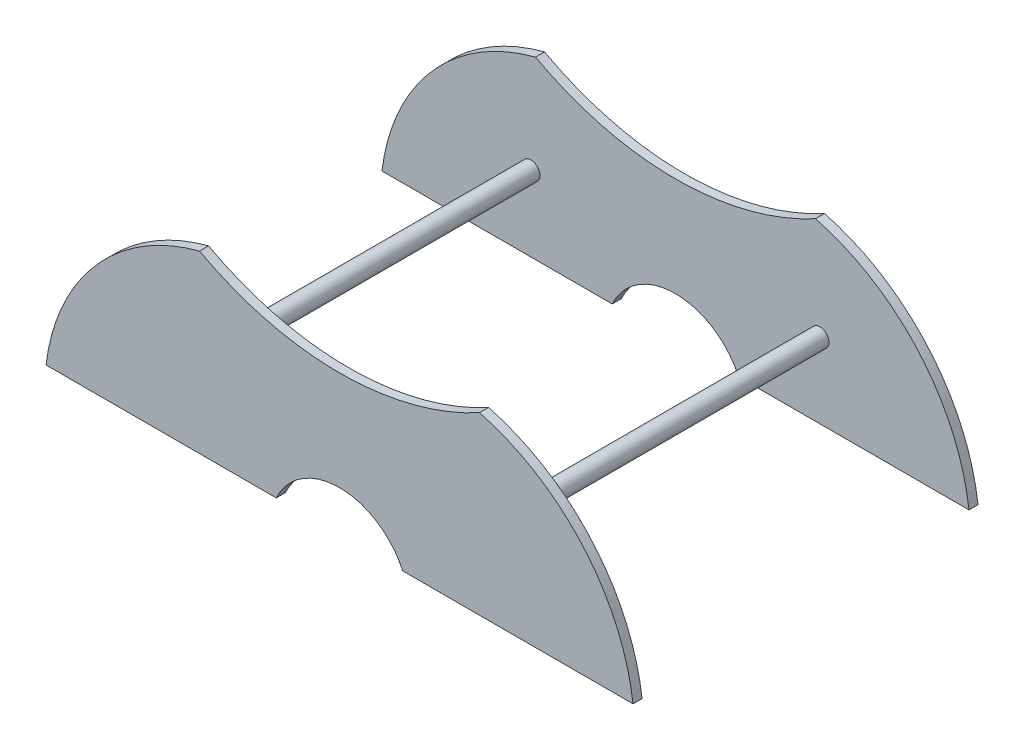
ISO-10303-21;
HEADER;
FILE_DESCRIPTION(('STEP AP214'),'2;1');
FILE_NAME('part.step','',(''),(''),'','','');
FILE_SCHEMA(('AUTOMOTIVE_DESIGN { 1 0 10303 214 1 1 1 1 }'));
ENDSEC;
DATA;
#1=APPLICATION_CONTEXT('core data for automotive mechanical design processes');
#2=APPLICATION_PROTOCOL_DEFINITION('international standard','automotive_design',2000,#1);
#3=PRODUCT_CONTEXT('',#1,'mechanical');
#4=PRODUCT('Part','Part','',(#3));
#5=PRODUCT_RELATED_PRODUCT_CATEGORY('part','',(#4));
#6=PRODUCT_DEFINITION_FORMATION('','',#4);
#7=PRODUCT_DEFINITION_CONTEXT('part definition',#1,'design');
#8=PRODUCT_DEFINITION('design','',#6,#7);
#9=PRODUCT_DEFINITION_SHAPE('','',#8);
#10=(LENGTH_UNIT() NAMED_UNIT(*) SI_UNIT(.MILLI.,.METRE.));
#11=(NAMED_UNIT(*) PLANE_ANGLE_UNIT() SI_UNIT($,.RADIAN.));
#12=(NAMED_UNIT(*) SI_UNIT($,.STERADIAN.) SOLID_ANGLE_UNIT());
#13=UNCERTAINTY_MEASURE_WITH_UNIT(LENGTH_MEASURE(1.E-05),#10,'distance_accuracy_value','');
#14=(GEOMETRIC_REPRESENTATION_CONTEXT(3) GLOBAL_UNCERTAINTY_ASSIGNED_CONTEXT((#13)) GLOBAL_UNIT_ASSIGNED_CONTEXT((#10,
#11,#12)) REPRESENTATION_CONTEXT('',''));
#15=CARTESIAN_POINT('',(0.,0.,0.));
#16=DIRECTION('',(0.,0.,1.));
#17=DIRECTION('',(1.,0.,0.));
#18=AXIS2_PLACEMENT_3D('',#15,#16,#17);
#19=CARTESIAN_POINT('',(0.,-32.0780298646909,10.));
#20=DIRECTION('',(0.,0.,-1.));
#21=DIRECTION('',(-1.,0.,0.));
#22=AXIS2_PLACEMENT_3D('',#19,#20,#21);
#23=CYLINDRICAL_SURFACE('',#22,77.);
#24=CARTESIAN_POINT('',(0.,-32.0780298646909,0.));
#25=DIRECTION('',(0.,0.,-1.));
#26=DIRECTION('',(-1.,0.,0.));
#27=AXIS2_PLACEMENT_3D('',#24,#25,#26);
#28=CIRCLE('',#27,77.);
#29=CARTESIAN_POINT('',(-70.,0.,0.));
#30=VERTEX_POINT('',#29);
#31=CARTESIAN_POINT('',(70.,0.,0.));
#32=VERTEX_POINT('',#31);
#33=EDGE_CURVE('E123',#30,#32,#28,.T.);
#34=ORIENTED_EDGE('',*,*,#33,.T.);
#35=DIRECTION('',(0.,0.,-1.));
#36=VECTOR('',#35,1.);
#37=CARTESIAN_POINT('',(70.,0.,10.));
#38=LINE('',#37,#36);
#39=CARTESIAN_POINT('',(70.,0.,10.));
#40=VERTEX_POINT('',#39);
#41=EDGE_CURVE('E141',#40,#32,#38,.T.);
#42=ORIENTED_EDGE('',*,*,#41,.F.);
#43=CARTESIAN_POINT('',(0.,-32.0780298646909,10.));
#44=DIRECTION('',(0.,0.,-1.));
#45=DIRECTION('',(-1.,0.,0.));
#46=AXIS2_PLACEMENT_3D('',#43,#44,#45);
#47=CIRCLE('',#46,77.);
#48=CARTESIAN_POINT('',(-70.,0.,10.));
#49=VERTEX_POINT('',#48);
#50=EDGE_CURVE('E134',#49,#40,#47,.T.);
#51=ORIENTED_EDGE('',*,*,#50,.F.);
#52=DIRECTION('',(0.,0.,-1.));
#53=VECTOR('',#52,1.);
#54=CARTESIAN_POINT('',(-70.,0.,10.));
#55=LINE('',#54,#53);
#56=EDGE_CURVE('E119',#49,#30,#55,.T.);
#57=ORIENTED_EDGE('',*,*,#56,.T.);
#58=EDGE_LOOP('',(#34,#42,#51,#57));
#59=FACE_BOUND('',#58,.T.);
#60=ADVANCED_FACE('F32',(#59),#23,.F.);
#61=CARTESIAN_POINT('',(70.,0.,10.));
#62=DIRECTION('',(0.,1.,0.));
#63=DIRECTION('',(0.,0.,1.));
#64=AXIS2_PLACEMENT_3D('',#61,#62,#63);
#65=PLANE('',#64);
#66=DIRECTION('',(1.,0.,0.));
#67=VECTOR('',#66,1.);
#68=CARTESIAN_POINT('',(70.,0.,0.));
#69=LINE('',#68,#67);
#70=CARTESIAN_POINT('',(325.,0.,0.));
#71=VERTEX_POINT('',#70);
#72=EDGE_CURVE('E126',#32,#71,#69,.T.);
#73=ORIENTED_EDGE('',*,*,#72,.T.);
#74=DIRECTION('',(0.,0.,-1.));
#75=VECTOR('',#74,1.);
#76=CARTESIAN_POINT('',(325.,0.,10.));
#77=LINE('',#76,#75);
#78=CARTESIAN_POINT('',(325.,0.,10.));
#79=VERTEX_POINT('',#78);
#80=EDGE_CURVE('E138',#79,#71,#77,.T.);
#81=ORIENTED_EDGE('',*,*,#80,.F.);
#82=DIRECTION('',(1.,0.,0.));
#83=VECTOR('',#82,1.);
#84=CARTESIAN_POINT('',(70.,0.,10.));
#85=LINE('',#84,#83);
#86=EDGE_CURVE('E89',#40,#79,#85,.T.);
#87=ORIENTED_EDGE('',*,*,#86,.F.);
#88=ORIENTED_EDGE('',*,*,#41,.T.);
#89=EDGE_LOOP('',(#73,#81,#87,#88));
#90=FACE_BOUND('',#89,.T.);
#91=ADVANCED_FACE('F210',(#90),#65,.F.);
#92=CARTESIAN_POINT('',(96.7434752557816,-28.2658612409388,10.));
#93=DIRECTION('',(0.,0.,-1.));
#94=DIRECTION('',(-1.,0.,0.));
#95=AXIS2_PLACEMENT_3D('',#92,#93,#94);
#96=CYLINDRICAL_SURFACE('',#95,230.);
#97=CARTESIAN_POINT('',(96.7434752557816,-28.2658612409388,0.));
#98=DIRECTION('',(0.,0.,1.));
#99=DIRECTION('',(1.,0.,0.));
#100=AXIS2_PLACEMENT_3D('',#97,#98,#99);
#101=CIRCLE('',#100,230.);
#102=CARTESIAN_POINT('',(155.,194.233975443779,0.));
#103=VERTEX_POINT('',#102);
#104=EDGE_CURVE('E129',#71,#103,#101,.T.);
#105=ORIENTED_EDGE('',*,*,#104,.T.);
#106=DIRECTION('',(0.,0.,-1.));
#107=VECTOR('',#106,1.);
#108=CARTESIAN_POINT('',(155.,194.233975443779,10.));
#109=LINE('',#108,#107);
#110=CARTESIAN_POINT('',(155.,194.233975443779,10.));
#111=VERTEX_POINT('',#110);
#112=EDGE_CURVE('E114',#111,#103,#109,.T.);
#113=ORIENTED_EDGE('',*,*,#112,.F.);
#114=CARTESIAN_POINT('',(96.7434752557816,-28.2658612409388,10.));
#115=DIRECTION('',(0.,0.,1.));
#116=DIRECTION('',(1.,0.,0.));
#117=AXIS2_PLACEMENT_3D('',#114,#115,#116);
#118=CIRCLE('',#117,230.);
#119=EDGE_CURVE('E105',#79,#111,#118,.T.);
#120=ORIENTED_EDGE('',*,*,#119,.F.);
#121=ORIENTED_EDGE('',*,*,#80,.T.);
#122=EDGE_LOOP('',(#105,#113,#120,#121));
#123=FACE_BOUND('',#122,.T.);
#124=ADVANCED_FACE('F213',(#123),#96,.T.);
#125=CARTESIAN_POINT('',(0.,480.146205845612,10.));
#126=DIRECTION('',(0.,0.,-1.));
#127=DIRECTION('',(-1.,0.,0.));
#128=AXIS2_PLACEMENT_3D('',#125,#126,#127);
#129=CYLINDRICAL_SURFACE('',#128,325.224235710303);
#130=CARTESIAN_POINT('',(0.,480.146205845612,0.));
#131=DIRECTION('',(0.,0.,-1.));
#132=DIRECTION('',(1.,0.,0.));
#133=AXIS2_PLACEMENT_3D('',#130,#131,#132);
#134=CIRCLE('',#133,325.224235710303);
#135=CARTESIAN_POINT('',(-155.,194.233975443779,0.));
#136=VERTEX_POINT('',#135);
#137=EDGE_CURVE('E113',#103,#136,#134,.T.);
#138=ORIENTED_EDGE('',*,*,#137,.T.);
#139=DIRECTION('',(0.,0.,-1.));
#140=VECTOR('',#139,1.);
#141=CARTESIAN_POINT('',(-155.,194.233975443779,10.));
#142=LINE('',#141,#140);
#143=CARTESIAN_POINT('',(-155.,194.233975443779,10.));
#144=VERTEX_POINT('',#143);
#145=EDGE_CURVE('E110',#144,#136,#142,.T.);
#146=ORIENTED_EDGE('',*,*,#145,.F.);
#147=CARTESIAN_POINT('',(0.,480.146205845612,10.));
#148=DIRECTION('',(0.,0.,-1.));
#149=DIRECTION('',(1.,0.,0.));
#150=AXIS2_PLACEMENT_3D('',#147,#148,#149);
#151=CIRCLE('',#150,325.224235710303);
#152=EDGE_CURVE('E99',#111,#144,#151,.T.);
#153=ORIENTED_EDGE('',*,*,#152,.F.);
#154=ORIENTED_EDGE('',*,*,#112,.T.);
#155=EDGE_LOOP('',(#138,#146,#153,#154));
#156=FACE_BOUND('',#155,.T.);
#157=ADVANCED_FACE('F111',(#156),#129,.F.);
#158=CARTESIAN_POINT('',(-96.7434752557816,-28.2658612409388,10.));
#159=DIRECTION('',(0.,0.,-1.));
#160=DIRECTION('',(-1.,0.,0.));
#161=AXIS2_PLACEMENT_3D('',#158,#159,#160);
#162=CYLINDRICAL_SURFACE('',#161,230.);
#163=CARTESIAN_POINT('',(-96.7434752557816,-28.2658612409388,0.));
#164=DIRECTION('',(0.,0.,1.));
#165=DIRECTION('',(-1.,0.,0.));
#166=AXIS2_PLACEMENT_3D('',#163,#164,#165);
#167=CIRCLE('',#166,230.);
#168=CARTESIAN_POINT('',(-325.,0.,0.));
#169=VERTEX_POINT('',#168);
#170=EDGE_CURVE('E74',#136,#169,#167,.T.);
#171=ORIENTED_EDGE('',*,*,#170,.T.);
#172=DIRECTION('',(0.,0.,-1.));
#173=VECTOR('',#172,1.);
#174=CARTESIAN_POINT('',(-325.,0.,10.));
#175=LINE('',#174,#173);
#176=CARTESIAN_POINT('',(-325.,0.,10.));
#177=VERTEX_POINT('',#176);
#178=EDGE_CURVE('E115',#177,#169,#175,.T.);
#179=ORIENTED_EDGE('',*,*,#178,.F.);
#180=CARTESIAN_POINT('',(-96.7434752557816,-28.2658612409388,10.));
#181=DIRECTION('',(0.,0.,1.));
#182=DIRECTION('',(-1.,0.,0.));
#183=AXIS2_PLACEMENT_3D('',#180,#181,#182);
#184=CIRCLE('',#183,230.);
#185=EDGE_CURVE('E103',#144,#177,#184,.T.);
#186=ORIENTED_EDGE('',*,*,#185,.F.);
#187=ORIENTED_EDGE('',*,*,#145,.T.);
#188=EDGE_LOOP('',(#171,#179,#186,#187));
#189=FACE_BOUND('',#188,.T.);
#190=ADVANCED_FACE('F117',(#189),#162,.T.);
#191=CARTESIAN_POINT('',(-325.,0.,10.));
#192=DIRECTION('',(0.,1.,0.));
#193=DIRECTION('',(0.,0.,1.));
#194=AXIS2_PLACEMENT_3D('',#191,#192,#193);
#195=PLANE('',#194);
#196=DIRECTION('',(1.,0.,0.));
#197=VECTOR('',#196,1.);
#198=CARTESIAN_POINT('',(-325.,0.,0.));
#199=LINE('',#198,#197);
#200=EDGE_CURVE('E80',#169,#30,#199,.T.);
#201=ORIENTED_EDGE('',*,*,#200,.T.);
#202=ORIENTED_EDGE('',*,*,#56,.F.);
#203=DIRECTION('',(1.,0.,0.));
#204=VECTOR('',#203,1.);
#205=CARTESIAN_POINT('',(-325.,0.,10.));
#206=LINE('',#205,#204);
#207=EDGE_CURVE('E50',#177,#49,#206,.T.);
#208=ORIENTED_EDGE('',*,*,#207,.F.);
#209=ORIENTED_EDGE('',*,*,#178,.T.);
#210=EDGE_LOOP('',(#201,#202,#208,#209));
#211=FACE_BOUND('',#210,.T.);
#212=ADVANCED_FACE('F218',(#211),#195,.F.);
#213=CARTESIAN_POINT('',(0.,-32.0780298646909,10.));
#214=DIRECTION('',(0.,0.,-1.));
#215=DIRECTION('',(-1.,0.,0.));
#216=AXIS2_PLACEMENT_3D('',#213,#214,#215);
#217=PLANE('',#216);
#218=ORIENTED_EDGE('',*,*,#50,.T.);
#219=ORIENTED_EDGE('',*,*,#86,.T.);
#220=ORIENTED_EDGE('',*,*,#119,.T.);
#221=ORIENTED_EDGE('',*,*,#152,.T.);
#222=ORIENTED_EDGE('',*,*,#185,.T.);
#223=ORIENTED_EDGE('',*,*,#207,.T.);
#224=EDGE_LOOP('',(#218,#219,#220,#221,#222,#223));
#225=FACE_BOUND('',#224,.T.);
#226=ADVANCED_FACE('F101',(#225),#217,.F.);
#227=CARTESIAN_POINT('',(0.,-32.0780298646909,0.));
#228=DIRECTION('',(0.,0.,-1.));
#229=DIRECTION('',(-1.,0.,0.));
#230=AXIS2_PLACEMENT_3D('',#227,#228,#229);
#231=PLANE('',#230);
#232=CARTESIAN_POINT('',(160.,83.1009624501835,0.));
#233=DIRECTION('',(0.,0.,-1.));
#234=DIRECTION('',(-1.,0.,0.));
#235=AXIS2_PLACEMENT_3D('',#232,#233,#234);
#236=CIRCLE('',#235,10.);
#237=CARTESIAN_POINT('',(150.,83.1009624501835,0.));
#238=VERTEX_POINT('',#237);
#239=EDGE_CURVE('E11',#238,#238,#236,.T.);
#240=ORIENTED_EDGE('',*,*,#239,.F.);
#241=EDGE_LOOP('',(#240));
#242=FACE_BOUND('',#241,.T.);
#243=CARTESIAN_POINT('',(-160.,83.1009624501835,0.));
#244=DIRECTION('',(0.,0.,-1.));
#245=DIRECTION('',(-1.,0.,0.));
#246=AXIS2_PLACEMENT_3D('',#243,#244,#245);
#247=CIRCLE('',#246,10.);
#248=CARTESIAN_POINT('',(-170.,83.1009624501835,0.));
#249=VERTEX_POINT('',#248);
#250=EDGE_CURVE('E142',#249,#249,#247,.T.);
#251=ORIENTED_EDGE('',*,*,#250,.F.);
#252=EDGE_LOOP('',(#251));
#253=FACE_BOUND('',#252,.T.);
#254=ORIENTED_EDGE('',*,*,#33,.F.);
#255=ORIENTED_EDGE('',*,*,#200,.F.);
#256=ORIENTED_EDGE('',*,*,#170,.F.);
#257=ORIENTED_EDGE('',*,*,#137,.F.);
#258=ORIENTED_EDGE('',*,*,#104,.F.);
#259=ORIENTED_EDGE('',*,*,#72,.F.);
#260=EDGE_LOOP('',(#254,#255,#256,#257,#258,#259));
#261=FACE_BOUND('',#260,.T.);
#262=ADVANCED_FACE('F216',(#242,#253,#261),#231,.T.);
#263=CARTESIAN_POINT('',(-160.,83.1009624501835,-400.284271247462));
#264=DIRECTION('',(0.,0.,1.));
#265=DIRECTION('',(1.,0.,0.));
#266=AXIS2_PLACEMENT_3D('',#263,#264,#265);
#267=CYLINDRICAL_SURFACE('',#266,10.);
#268=CARTESIAN_POINT('',(-160.,83.1009624501835,-362.));
#269=DIRECTION('',(0.,0.,1.));
#270=DIRECTION('',(1.,0.,0.));
#271=AXIS2_PLACEMENT_3D('',#268,#269,#270);
#272=CIRCLE('',#271,10.);
#273=CARTESIAN_POINT('',(-150.,83.1009624501835,-362.));
#274=VERTEX_POINT('',#273);
#275=EDGE_CURVE('E35',#274,#274,#272,.F.);
#276=ORIENTED_EDGE('',*,*,#275,.F.);
#277=EDGE_LOOP('',(#276));
#278=FACE_BOUND('',#277,.T.);
#279=ORIENTED_EDGE('',*,*,#250,.T.);
#280=EDGE_LOOP('',(#279));
#281=FACE_BOUND('',#280,.T.);
#282=ADVANCED_FACE('F265',(#278,#281),#267,.T.);
#283=CARTESIAN_POINT('',(0.,-32.0780298646909,-372.));
#284=DIRECTION('',(0.,0.,1.));
#285=DIRECTION('',(1.,0.,0.));
#286=AXIS2_PLACEMENT_3D('',#283,#284,#285);
#287=CYLINDRICAL_SURFACE('',#286,77.);
#288=CARTESIAN_POINT('',(0.,-32.0780298646909,-362.));
#289=DIRECTION('',(0.,0.,-1.));
#290=DIRECTION('',(1.,0.,0.));
#291=AXIS2_PLACEMENT_3D('',#288,#289,#290);
#292=CIRCLE('',#291,77.);
#293=CARTESIAN_POINT('',(-70.,0.,-362.));
#294=VERTEX_POINT('',#293);
#295=CARTESIAN_POINT('',(70.,0.,-362.));
#296=VERTEX_POINT('',#295);
#297=EDGE_CURVE('E174',#294,#296,#292,.T.);
#298=ORIENTED_EDGE('',*,*,#297,.F.);
#299=DIRECTION('',(0.,0.,1.));
#300=VECTOR('',#299,1.);
#301=CARTESIAN_POINT('',(-70.,0.,-372.));
#302=LINE('',#301,#300);
#303=CARTESIAN_POINT('',(-70.,0.,-372.));
#304=VERTEX_POINT('',#303);
#305=EDGE_CURVE('E127',#304,#294,#302,.T.);
#306=ORIENTED_EDGE('',*,*,#305,.F.);
#307=CARTESIAN_POINT('',(0.,-32.0780298646909,-372.));
#308=DIRECTION('',(0.,0.,-1.));
#309=DIRECTION('',(1.,0.,0.));
#310=AXIS2_PLACEMENT_3D('',#307,#308,#309);
#311=CIRCLE('',#310,77.);
#312=CARTESIAN_POINT('',(70.,0.,-372.));
#313=VERTEX_POINT('',#312);
#314=EDGE_CURVE('E154',#304,#313,#311,.T.);
#315=ORIENTED_EDGE('',*,*,#314,.T.);
#316=DIRECTION('',(0.,0.,1.));
#317=VECTOR('',#316,1.);
#318=CARTESIAN_POINT('',(70.,0.,-372.));
#319=LINE('',#318,#317);
#320=EDGE_CURVE('E173',#313,#296,#319,.T.);
#321=ORIENTED_EDGE('',*,*,#320,.T.);
#322=EDGE_LOOP('',(#298,#306,#315,#321));
#323=FACE_BOUND('',#322,.T.);
#324=ADVANCED_FACE('F275',(#323),#287,.F.);
#325=CARTESIAN_POINT('',(-325.,0.,-372.));
#326=DIRECTION('',(0.,-1.,0.));
#327=DIRECTION('',(1.,0.,0.));
#328=AXIS2_PLACEMENT_3D('',#325,#326,#327);
#329=PLANE('',#328);
#330=DIRECTION('',(1.,0.,0.));
#331=VECTOR('',#330,1.);
#332=CARTESIAN_POINT('',(-325.,0.,-362.));
#333=LINE('',#332,#331);
#334=CARTESIAN_POINT('',(-325.,0.,-362.));
#335=VERTEX_POINT('',#334);
#336=EDGE_CURVE('E158',#335,#294,#333,.T.);
#337=ORIENTED_EDGE('',*,*,#336,.F.);
#338=DIRECTION('',(0.,0.,1.));
#339=VECTOR('',#338,1.);
#340=CARTESIAN_POINT('',(-325.,0.,-372.));
#341=LINE('',#340,#339);
#342=CARTESIAN_POINT('',(-325.,0.,-372.));
#343=VERTEX_POINT('',#342);
#344=EDGE_CURVE('E193',#343,#335,#341,.T.);
#345=ORIENTED_EDGE('',*,*,#344,.F.);
#346=DIRECTION('',(1.,0.,0.));
#347=VECTOR('',#346,1.);
#348=CARTESIAN_POINT('',(-325.,0.,-372.));
#349=LINE('',#348,#347);
#350=EDGE_CURVE('E170',#343,#304,#349,.T.);
#351=ORIENTED_EDGE('',*,*,#350,.T.);
#352=ORIENTED_EDGE('',*,*,#305,.T.);
#353=EDGE_LOOP('',(#337,#345,#351,#352));
#354=FACE_BOUND('',#353,.T.);
#355=ADVANCED_FACE('F286',(#354),#329,.T.);
#356=CARTESIAN_POINT('',(-96.7434752557816,-28.2658612409388,-372.));
#357=DIRECTION('',(0.,0.,1.));
#358=DIRECTION('',(1.,0.,0.));
#359=AXIS2_PLACEMENT_3D('',#356,#357,#358);
#360=CYLINDRICAL_SURFACE('',#359,230.);
#361=CARTESIAN_POINT('',(-96.7434752557816,-28.2658612409388,-362.));
#362=DIRECTION('',(0.,0.,1.));
#363=DIRECTION('',(1.,0.,0.));
#364=AXIS2_PLACEMENT_3D('',#361,#362,#363);
#365=CIRCLE('',#364,230.);
#366=CARTESIAN_POINT('',(-155.,194.233975443779,-362.));
#367=VERTEX_POINT('',#366);
#368=EDGE_CURVE('E186',#367,#335,#365,.T.);
#369=ORIENTED_EDGE('',*,*,#368,.F.);
#370=DIRECTION('',(0.,0.,1.));
#371=VECTOR('',#370,1.);
#372=CARTESIAN_POINT('',(-155.,194.233975443779,-372.));
#373=LINE('',#372,#371);
#374=CARTESIAN_POINT('',(-155.,194.233975443779,-372.));
#375=VERTEX_POINT('',#374);
#376=EDGE_CURVE('E196',#375,#367,#373,.T.);
#377=ORIENTED_EDGE('',*,*,#376,.F.);
#378=CARTESIAN_POINT('',(-96.7434752557816,-28.2658612409388,-372.));
#379=DIRECTION('',(0.,0.,1.));
#380=DIRECTION('',(1.,0.,0.));
#381=AXIS2_PLACEMENT_3D('',#378,#379,#380);
#382=CIRCLE('',#381,230.);
#383=EDGE_CURVE('E167',#375,#343,#382,.T.);
#384=ORIENTED_EDGE('',*,*,#383,.T.);
#385=ORIENTED_EDGE('',*,*,#344,.T.);
#386=EDGE_LOOP('',(#369,#377,#384,#385));
#387=FACE_BOUND('',#386,.T.);
#388=ADVANCED_FACE('F296',(#387),#360,.T.);
#389=CARTESIAN_POINT('',(0.,480.146205845612,-372.));
#390=DIRECTION('',(0.,0.,1.));
#391=DIRECTION('',(1.,0.,0.));
#392=AXIS2_PLACEMENT_3D('',#389,#390,#391);
#393=CYLINDRICAL_SURFACE('',#392,325.224235710303);
#394=CARTESIAN_POINT('',(0.,480.146205845612,-362.));
#395=DIRECTION('',(0.,0.,-1.));
#396=DIRECTION('',(1.,0.,0.));
#397=AXIS2_PLACEMENT_3D('',#394,#395,#396);
#398=CIRCLE('',#397,325.224235710303);
#399=CARTESIAN_POINT('',(155.,194.233975443779,-362.));
#400=VERTEX_POINT('',#399);
#401=EDGE_CURVE('E183',#400,#367,#398,.T.);
#402=ORIENTED_EDGE('',*,*,#401,.F.);
#403=DIRECTION('',(0.,0.,1.));
#404=VECTOR('',#403,1.);
#405=CARTESIAN_POINT('',(155.,194.233975443779,-372.));
#406=LINE('',#405,#404);
#407=CARTESIAN_POINT('',(155.,194.233975443779,-372.));
#408=VERTEX_POINT('',#407);
#409=EDGE_CURVE('E199',#408,#400,#406,.T.);
#410=ORIENTED_EDGE('',*,*,#409,.F.);
#411=CARTESIAN_POINT('',(0.,480.146205845612,-372.));
#412=DIRECTION('',(0.,0.,-1.));
#413=DIRECTION('',(1.,0.,0.));
#414=AXIS2_PLACEMENT_3D('',#411,#412,#413);
#415=CIRCLE('',#414,325.224235710303);
#416=EDGE_CURVE('E164',#408,#375,#415,.T.);
#417=ORIENTED_EDGE('',*,*,#416,.T.);
#418=ORIENTED_EDGE('',*,*,#376,.T.);
#419=EDGE_LOOP('',(#402,#410,#417,#418));
#420=FACE_BOUND('',#419,.T.);
#421=ADVANCED_FACE('F306',(#420),#393,.F.);
#422=CARTESIAN_POINT('',(96.7434752557816,-28.2658612409388,-372.));
#423=DIRECTION('',(0.,0.,1.));
#424=DIRECTION('',(1.,0.,0.));
#425=AXIS2_PLACEMENT_3D('',#422,#423,#424);
#426=CYLINDRICAL_SURFACE('',#425,230.);
#427=CARTESIAN_POINT('',(96.7434752557816,-28.2658612409388,-362.));
#428=DIRECTION('',(0.,0.,1.));
#429=DIRECTION('',(1.,0.,0.));
#430=AXIS2_PLACEMENT_3D('',#427,#428,#429);
#431=CIRCLE('',#430,230.);
#432=CARTESIAN_POINT('',(325.,0.,-362.));
#433=VERTEX_POINT('',#432);
#434=EDGE_CURVE('E180',#433,#400,#431,.T.);
#435=ORIENTED_EDGE('',*,*,#434,.F.);
#436=DIRECTION('',(0.,0.,1.));
#437=VECTOR('',#436,1.);
#438=CARTESIAN_POINT('',(325.,0.,-372.));
#439=LINE('',#438,#437);
#440=CARTESIAN_POINT('',(325.,0.,-372.));
#441=VERTEX_POINT('',#440);
#442=EDGE_CURVE('E202',#441,#433,#439,.T.);
#443=ORIENTED_EDGE('',*,*,#442,.F.);
#444=CARTESIAN_POINT('',(96.7434752557816,-28.2658612409388,-372.));
#445=DIRECTION('',(0.,0.,1.));
#446=DIRECTION('',(1.,0.,0.));
#447=AXIS2_PLACEMENT_3D('',#444,#445,#446);
#448=CIRCLE('',#447,230.);
#449=EDGE_CURVE('E161',#441,#408,#448,.T.);
#450=ORIENTED_EDGE('',*,*,#449,.T.);
#451=ORIENTED_EDGE('',*,*,#409,.T.);
#452=EDGE_LOOP('',(#435,#443,#450,#451));
#453=FACE_BOUND('',#452,.T.);
#454=ADVANCED_FACE('F316',(#453),#426,.T.);
#455=CARTESIAN_POINT('',(70.,0.,-372.));
#456=DIRECTION('',(0.,-1.,0.));
#457=DIRECTION('',(1.,0.,0.));
#458=AXIS2_PLACEMENT_3D('',#455,#456,#457);
#459=PLANE('',#458);
#460=DIRECTION('',(1.,0.,0.));
#461=VECTOR('',#460,1.);
#462=CARTESIAN_POINT('',(70.,0.,-362.));
#463=LINE('',#462,#461);
#464=EDGE_CURVE('E177',#296,#433,#463,.T.);
#465=ORIENTED_EDGE('',*,*,#464,.F.);
#466=ORIENTED_EDGE('',*,*,#320,.F.);
#467=DIRECTION('',(1.,0.,0.));
#468=VECTOR('',#467,1.);
#469=CARTESIAN_POINT('',(70.,0.,-372.));
#470=LINE('',#469,#468);
#471=EDGE_CURVE('E157',#313,#441,#470,.T.);
#472=ORIENTED_EDGE('',*,*,#471,.T.);
#473=ORIENTED_EDGE('',*,*,#442,.T.);
#474=EDGE_LOOP('',(#465,#466,#472,#473));
#475=FACE_BOUND('',#474,.T.);
#476=ADVANCED_FACE('F326',(#475),#459,.T.);
#477=CARTESIAN_POINT('',(0.,-32.0780298646909,-362.));
#478=DIRECTION('',(0.,0.,1.));
#479=DIRECTION('',(1.,0.,0.));
#480=AXIS2_PLACEMENT_3D('',#477,#478,#479);
#481=PLANE('',#480);
#482=CARTESIAN_POINT('',(160.,83.1009624501835,-362.));
#483=DIRECTION('',(0.,0.,1.));
#484=DIRECTION('',(1.,0.,0.));
#485=AXIS2_PLACEMENT_3D('',#482,#483,#484);
#486=CIRCLE('',#485,10.);
#487=CARTESIAN_POINT('',(170.,83.1009624501835,-362.));
#488=VERTEX_POINT('',#487);
#489=EDGE_CURVE('E41',#488,#488,#486,.T.);
#490=ORIENTED_EDGE('',*,*,#489,.F.);
#491=EDGE_LOOP('',(#490));
#492=FACE_BOUND('',#491,.T.);
#493=ORIENTED_EDGE('',*,*,#275,.T.);
#494=EDGE_LOOP('',(#493));
#495=FACE_BOUND('',#494,.T.);
#496=ORIENTED_EDGE('',*,*,#297,.T.);
#497=ORIENTED_EDGE('',*,*,#464,.T.);
#498=ORIENTED_EDGE('',*,*,#434,.T.);
#499=ORIENTED_EDGE('',*,*,#401,.T.);
#500=ORIENTED_EDGE('',*,*,#368,.T.);
#501=ORIENTED_EDGE('',*,*,#336,.T.);
#502=EDGE_LOOP('',(#496,#497,#498,#499,#500,#501));
#503=FACE_BOUND('',#502,.T.);
#504=ADVANCED_FACE('F336',(#492,#495,#503),#481,.T.);
#505=CARTESIAN_POINT('',(0.,-32.0780298646909,-372.));
#506=DIRECTION('',(0.,0.,1.));
#507=DIRECTION('',(1.,0.,0.));
#508=AXIS2_PLACEMENT_3D('',#505,#506,#507);
#509=PLANE('',#508);
#510=ORIENTED_EDGE('',*,*,#314,.F.);
#511=ORIENTED_EDGE('',*,*,#350,.F.);
#512=ORIENTED_EDGE('',*,*,#383,.F.);
#513=ORIENTED_EDGE('',*,*,#416,.F.);
#514=ORIENTED_EDGE('',*,*,#449,.F.);
#515=ORIENTED_EDGE('',*,*,#471,.F.);
#516=EDGE_LOOP('',(#510,#511,#512,#513,#514,#515));
#517=FACE_BOUND('',#516,.T.);
#518=ADVANCED_FACE('F346',(#517),#509,.F.);
#519=CARTESIAN_POINT('',(160.,83.1009624501835,-400.284271247462));
#520=DIRECTION('',(0.,0.,1.));
#521=DIRECTION('',(1.,0.,0.));
#522=AXIS2_PLACEMENT_3D('',#519,#520,#521);
#523=CYLINDRICAL_SURFACE('',#522,10.);
#524=ORIENTED_EDGE('',*,*,#239,.T.);
#525=EDGE_LOOP('',(#524));
#526=FACE_BOUND('',#525,.T.);
#527=ORIENTED_EDGE('',*,*,#489,.T.);
#528=EDGE_LOOP('',(#527));
#529=FACE_BOUND('',#528,.T.);
#530=ADVANCED_FACE('F355',(#526,#529),#523,.T.);
#531=CLOSED_SHELL('',(#60,#91,#124,#157,#190,#212,#226,#262,#282,#324,#355,#388,#421,#454,#476,
#504,#518,#530));
#532=MANIFOLD_SOLID_BREP('B2',#531);
#533=ADVANCED_BREP_SHAPE_REPRESENTATION('',(#18,#532),#14);
#534=SHAPE_DEFINITION_REPRESENTATION(#9,#533);
ENDSEC;
END-ISO-10303-21;
